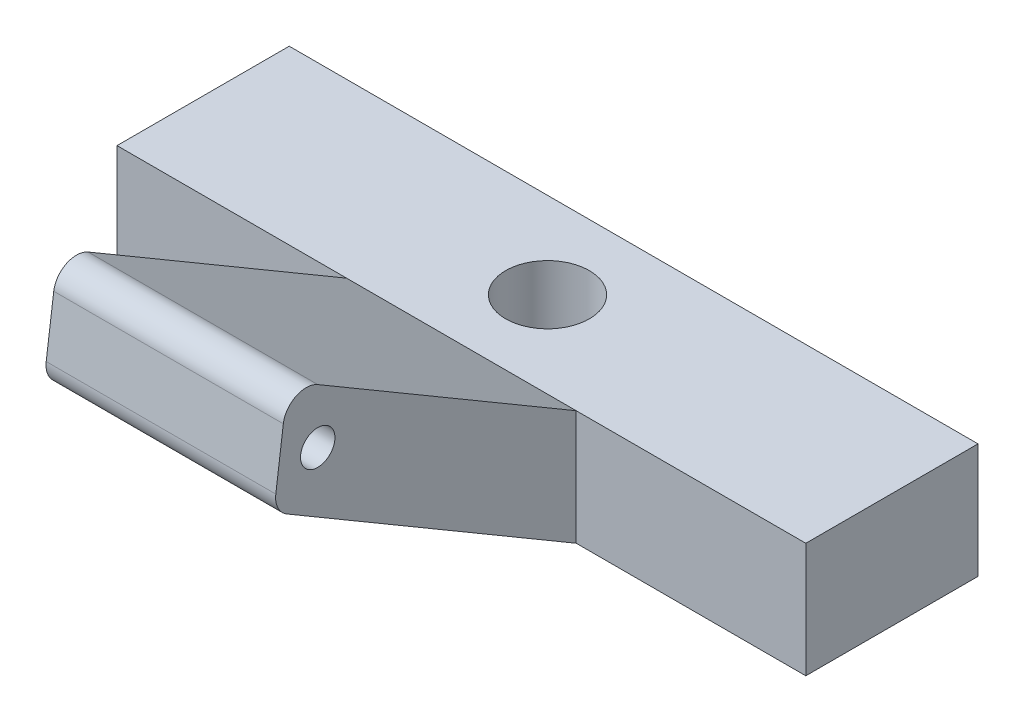
ISO-10303-21;
HEADER;
FILE_DESCRIPTION(('STEP AP214'),'2;1');
FILE_NAME('part.step','',(''),(''),'','','');
FILE_SCHEMA(('AUTOMOTIVE_DESIGN { 1 0 10303 214 1 1 1 1 }'));
ENDSEC;
DATA;
#1=APPLICATION_CONTEXT('core data for automotive mechanical design processes');
#2=APPLICATION_PROTOCOL_DEFINITION('international standard','automotive_design',2000,#1);
#3=PRODUCT_CONTEXT('',#1,'mechanical');
#4=PRODUCT('Part','Part','',(#3));
#5=PRODUCT_RELATED_PRODUCT_CATEGORY('part','',(#4));
#6=PRODUCT_DEFINITION_FORMATION('','',#4);
#7=PRODUCT_DEFINITION_CONTEXT('part definition',#1,'design');
#8=PRODUCT_DEFINITION('design','',#6,#7);
#9=PRODUCT_DEFINITION_SHAPE('','',#8);
#10=(LENGTH_UNIT() NAMED_UNIT(*) SI_UNIT(.MILLI.,.METRE.));
#11=(NAMED_UNIT(*) PLANE_ANGLE_UNIT() SI_UNIT($,.RADIAN.));
#12=(NAMED_UNIT(*) SI_UNIT($,.STERADIAN.) SOLID_ANGLE_UNIT());
#13=UNCERTAINTY_MEASURE_WITH_UNIT(LENGTH_MEASURE(1.E-05),#10,'distance_accuracy_value','');
#14=(GEOMETRIC_REPRESENTATION_CONTEXT(3) GLOBAL_UNCERTAINTY_ASSIGNED_CONTEXT((#13)) GLOBAL_UNIT_ASSIGNED_CONTEXT((#10,
#11,#12)) REPRESENTATION_CONTEXT('',''));
#15=CARTESIAN_POINT('',(0.,0.,0.));
#16=DIRECTION('',(0.,0.,1.));
#17=DIRECTION('',(1.,0.,0.));
#18=AXIS2_PLACEMENT_3D('',#15,#16,#17);
#19=CARTESIAN_POINT('',(-30.,10.,7.5));
#20=DIRECTION('',(0.,0.,-1.));
#21=DIRECTION('',(-1.,0.,0.));
#22=AXIS2_PLACEMENT_3D('',#19,#20,#21);
#23=PLANE('',#22);
#24=DIRECTION('',(0.,1.,0.));
#25=VECTOR('',#24,1.);
#26=CARTESIAN_POINT('',(10.,0.,7.5));
#27=LINE('',#26,#25);
#28=CARTESIAN_POINT('',(10.,0.,7.5));
#29=VERTEX_POINT('',#28);
#30=CARTESIAN_POINT('',(10.,10.,7.5));
#31=VERTEX_POINT('',#30);
#32=EDGE_CURVE('E143',#29,#31,#27,.T.);
#33=ORIENTED_EDGE('',*,*,#32,.F.);
#34=DIRECTION('',(1.,0.,0.));
#35=VECTOR('',#34,1.);
#36=CARTESIAN_POINT('',(-30.,0.,7.5));
#37=LINE('',#36,#35);
#38=CARTESIAN_POINT('',(30.,0.,7.5));
#39=VERTEX_POINT('',#38);
#40=EDGE_CURVE('E91',#29,#39,#37,.T.);
#41=ORIENTED_EDGE('',*,*,#40,.T.);
#42=DIRECTION('',(0.,-1.,0.));
#43=VECTOR('',#42,1.);
#44=CARTESIAN_POINT('',(30.,10.,7.5));
#45=LINE('',#44,#43);
#46=CARTESIAN_POINT('',(30.,10.,7.5));
#47=VERTEX_POINT('',#46);
#48=EDGE_CURVE('E154',#47,#39,#45,.T.);
#49=ORIENTED_EDGE('',*,*,#48,.F.);
#50=DIRECTION('',(1.,0.,0.));
#51=VECTOR('',#50,1.);
#52=CARTESIAN_POINT('',(-30.,10.,7.5));
#53=LINE('',#52,#51);
#54=EDGE_CURVE('E69',#31,#47,#53,.T.);
#55=ORIENTED_EDGE('',*,*,#54,.F.);
#56=EDGE_LOOP('',(#33,#41,#49,#55));
#57=FACE_BOUND('',#56,.T.);
#58=ADVANCED_FACE('F44',(#57),#23,.F.);
#59=CARTESIAN_POINT('',(0.,10.,0.));
#60=DIRECTION('',(0.,-1.,0.));
#61=DIRECTION('',(0.,0.,-1.));
#62=AXIS2_PLACEMENT_3D('',#59,#60,#61);
#63=PLANE('',#62);
#64=DIRECTION('',(0.,0.,-1.));
#65=VECTOR('',#64,1.);
#66=CARTESIAN_POINT('',(30.,10.,7.5));
#67=LINE('',#66,#65);
#68=CARTESIAN_POINT('',(30.,10.,-7.5));
#69=VERTEX_POINT('',#68);
#70=EDGE_CURVE('E186',#47,#69,#67,.T.);
#71=ORIENTED_EDGE('',*,*,#70,.T.);
#72=DIRECTION('',(-1.,0.,0.));
#73=VECTOR('',#72,1.);
#74=CARTESIAN_POINT('',(-30.,10.,-7.5));
#75=LINE('',#74,#73);
#76=CARTESIAN_POINT('',(-30.,10.,-7.5));
#77=VERTEX_POINT('',#76);
#78=EDGE_CURVE('E98',#69,#77,#75,.T.);
#79=ORIENTED_EDGE('',*,*,#78,.T.);
#80=DIRECTION('',(0.,0.,1.));
#81=VECTOR('',#80,1.);
#82=CARTESIAN_POINT('',(-30.,10.,7.5));
#83=LINE('',#82,#81);
#84=CARTESIAN_POINT('',(-30.,10.,7.5));
#85=VERTEX_POINT('',#84);
#86=EDGE_CURVE('E158',#77,#85,#83,.T.);
#87=ORIENTED_EDGE('',*,*,#86,.T.);
#88=CARTESIAN_POINT('',(-10.,10.,7.5));
#89=VERTEX_POINT('',#88);
#90=EDGE_CURVE('E157',#85,#89,#53,.T.);
#91=ORIENTED_EDGE('',*,*,#90,.T.);
#92=DIRECTION('',(1.,0.,0.));
#93=VECTOR('',#92,1.);
#94=CARTESIAN_POINT('',(-10.,10.,7.5));
#95=LINE('',#94,#93);
#96=EDGE_CURVE('E135',#89,#31,#95,.T.);
#97=ORIENTED_EDGE('',*,*,#96,.T.);
#98=ORIENTED_EDGE('',*,*,#54,.T.);
#99=EDGE_LOOP('',(#71,#79,#87,#91,#97,#98));
#100=FACE_BOUND('',#99,.T.);
#101=CARTESIAN_POINT('',(0.,10.,0.));
#102=DIRECTION('',(0.,1.,0.));
#103=DIRECTION('',(0.,0.,1.));
#104=AXIS2_PLACEMENT_3D('',#101,#102,#103);
#105=CIRCLE('',#104,3.64432939);
#106=CARTESIAN_POINT('',(0.,10.,3.64432939));
#107=VERTEX_POINT('',#106);
#108=EDGE_CURVE('E176',#107,#107,#105,.T.);
#109=ORIENTED_EDGE('',*,*,#108,.F.);
#110=EDGE_LOOP('',(#109));
#111=FACE_BOUND('',#110,.T.);
#112=ADVANCED_FACE('F161',(#100,#111),#63,.F.);
#113=CARTESIAN_POINT('',(0.,0.,0.));
#114=DIRECTION('',(0.,-1.,0.));
#115=DIRECTION('',(0.,0.,-1.));
#116=AXIS2_PLACEMENT_3D('',#113,#114,#115);
#117=PLANE('',#116);
#118=DIRECTION('',(0.,0.,-1.));
#119=VECTOR('',#118,1.);
#120=CARTESIAN_POINT('',(30.,0.,7.5));
#121=LINE('',#120,#119);
#122=CARTESIAN_POINT('',(30.,0.,-7.5));
#123=VERTEX_POINT('',#122);
#124=EDGE_CURVE('E180',#39,#123,#121,.T.);
#125=ORIENTED_EDGE('',*,*,#124,.F.);
#126=ORIENTED_EDGE('',*,*,#40,.F.);
#127=DIRECTION('',(1.,0.,0.));
#128=VECTOR('',#127,1.);
#129=CARTESIAN_POINT('',(-10.,0.,7.5));
#130=LINE('',#129,#128);
#131=CARTESIAN_POINT('',(-10.,0.,7.5));
#132=VERTEX_POINT('',#131);
#133=EDGE_CURVE('E185',#132,#29,#130,.T.);
#134=ORIENTED_EDGE('',*,*,#133,.F.);
#135=CARTESIAN_POINT('',(-30.,0.,7.5));
#136=VERTEX_POINT('',#135);
#137=EDGE_CURVE('E189',#136,#132,#37,.T.);
#138=ORIENTED_EDGE('',*,*,#137,.F.);
#139=DIRECTION('',(0.,0.,1.));
#140=VECTOR('',#139,1.);
#141=CARTESIAN_POINT('',(-30.,0.,7.5));
#142=LINE('',#141,#140);
#143=CARTESIAN_POINT('',(-30.,0.,-7.5));
#144=VERTEX_POINT('',#143);
#145=EDGE_CURVE('E201',#144,#136,#142,.T.);
#146=ORIENTED_EDGE('',*,*,#145,.F.);
#147=DIRECTION('',(-1.,0.,0.));
#148=VECTOR('',#147,1.);
#149=CARTESIAN_POINT('',(-30.,0.,-7.5));
#150=LINE('',#149,#148);
#151=EDGE_CURVE('E198',#123,#144,#150,.T.);
#152=ORIENTED_EDGE('',*,*,#151,.F.);
#153=EDGE_LOOP('',(#125,#126,#134,#138,#146,#152));
#154=FACE_BOUND('',#153,.T.);
#155=CARTESIAN_POINT('',(0.,0.,0.));
#156=DIRECTION('',(0.,1.,0.));
#157=DIRECTION('',(0.,0.,1.));
#158=AXIS2_PLACEMENT_3D('',#155,#156,#157);
#159=CIRCLE('',#158,3.64432939);
#160=CARTESIAN_POINT('',(0.,0.,3.64432939));
#161=VERTEX_POINT('',#160);
#162=EDGE_CURVE('E181',#161,#161,#159,.T.);
#163=ORIENTED_EDGE('',*,*,#162,.T.);
#164=EDGE_LOOP('',(#163));
#165=FACE_BOUND('',#164,.T.);
#166=ADVANCED_FACE('F222',(#154,#165),#117,.T.);
#167=CARTESIAN_POINT('',(30.,10.,7.5));
#168=DIRECTION('',(-1.,0.,0.));
#169=DIRECTION('',(0.,0.,1.));
#170=AXIS2_PLACEMENT_3D('',#167,#168,#169);
#171=PLANE('',#170);
#172=ORIENTED_EDGE('',*,*,#124,.T.);
#173=DIRECTION('',(0.,-1.,0.));
#174=VECTOR('',#173,1.);
#175=CARTESIAN_POINT('',(30.,10.,-7.5));
#176=LINE('',#175,#174);
#177=EDGE_CURVE('E11',#69,#123,#176,.T.);
#178=ORIENTED_EDGE('',*,*,#177,.F.);
#179=ORIENTED_EDGE('',*,*,#70,.F.);
#180=ORIENTED_EDGE('',*,*,#48,.T.);
#181=EDGE_LOOP('',(#172,#178,#179,#180));
#182=FACE_BOUND('',#181,.T.);
#183=ADVANCED_FACE('F46',(#182),#171,.F.);
#184=CARTESIAN_POINT('',(-30.,10.,-7.5));
#185=DIRECTION('',(0.,0.,1.));
#186=DIRECTION('',(1.,0.,0.));
#187=AXIS2_PLACEMENT_3D('',#184,#185,#186);
#188=PLANE('',#187);
#189=ORIENTED_EDGE('',*,*,#151,.T.);
#190=DIRECTION('',(0.,-1.,0.));
#191=VECTOR('',#190,1.);
#192=CARTESIAN_POINT('',(-30.,10.,-7.5));
#193=LINE('',#192,#191);
#194=EDGE_CURVE('E53',#77,#144,#193,.T.);
#195=ORIENTED_EDGE('',*,*,#194,.F.);
#196=ORIENTED_EDGE('',*,*,#78,.F.);
#197=ORIENTED_EDGE('',*,*,#177,.T.);
#198=EDGE_LOOP('',(#189,#195,#196,#197));
#199=FACE_BOUND('',#198,.T.);
#200=ADVANCED_FACE('F308',(#199),#188,.F.);
#201=CARTESIAN_POINT('',(-30.,10.,7.5));
#202=DIRECTION('',(1.,0.,0.));
#203=DIRECTION('',(0.,0.,-1.));
#204=AXIS2_PLACEMENT_3D('',#201,#202,#203);
#205=PLANE('',#204);
#206=ORIENTED_EDGE('',*,*,#145,.T.);
#207=DIRECTION('',(0.,-1.,0.));
#208=VECTOR('',#207,1.);
#209=CARTESIAN_POINT('',(-30.,10.,7.5));
#210=LINE('',#209,#208);
#211=EDGE_CURVE('E209',#85,#136,#210,.T.);
#212=ORIENTED_EDGE('',*,*,#211,.F.);
#213=ORIENTED_EDGE('',*,*,#86,.F.);
#214=ORIENTED_EDGE('',*,*,#194,.T.);
#215=EDGE_LOOP('',(#206,#212,#213,#214));
#216=FACE_BOUND('',#215,.T.);
#217=ADVANCED_FACE('F217',(#216),#205,.F.);
#218=ORIENTED_EDGE('',*,*,#137,.T.);
#219=DIRECTION('',(0.,1.,0.));
#220=VECTOR('',#219,1.);
#221=CARTESIAN_POINT('',(-10.,0.,7.5));
#222=LINE('',#221,#220);
#223=EDGE_CURVE('E227',#132,#89,#222,.T.);
#224=ORIENTED_EDGE('',*,*,#223,.T.);
#225=ORIENTED_EDGE('',*,*,#90,.F.);
#226=ORIENTED_EDGE('',*,*,#211,.T.);
#227=EDGE_LOOP('',(#218,#224,#225,#226));
#228=FACE_BOUND('',#227,.T.);
#229=ADVANCED_FACE('F226',(#228),#23,.F.);
#230=CARTESIAN_POINT('',(0.,10.,0.));
#231=DIRECTION('',(0.,-1.,0.));
#232=DIRECTION('',(0.,0.,-1.));
#233=AXIS2_PLACEMENT_3D('',#230,#231,#232);
#234=CYLINDRICAL_SURFACE('',#233,3.64432939);
#235=ORIENTED_EDGE('',*,*,#108,.T.);
#236=EDGE_LOOP('',(#235));
#237=FACE_BOUND('',#236,.T.);
#238=ORIENTED_EDGE('',*,*,#162,.F.);
#239=EDGE_LOOP('',(#238));
#240=FACE_BOUND('',#239,.T.);
#241=ADVANCED_FACE('F299',(#237,#240),#234,.F.);
#242=CARTESIAN_POINT('',(-10.,0.,7.5));
#243=DIRECTION('',(0.,-0.862171609476739,0.506616339859157));
#244=DIRECTION('',(0.,-0.506616339859157,-0.862171609476739));
#245=AXIS2_PLACEMENT_3D('',#242,#243,#244);
#246=PLANE('',#245);
#247=ORIENTED_EDGE('',*,*,#133,.T.);
#248=DIRECTION('',(0.,-0.506616339859157,-0.862171609476739));
#249=VECTOR('',#248,1.);
#250=CARTESIAN_POINT('',(10.,0.,7.5));
#251=LINE('',#250,#249);
#252=CARTESIAN_POINT('',(10.,14.8076057402578,32.6999319191409));
#253=VERTEX_POINT('',#252);
#254=EDGE_CURVE('E150',#253,#29,#251,.T.);
#255=ORIENTED_EDGE('',*,*,#254,.F.);
#256=DIRECTION('',(1.,0.,0.));
#257=VECTOR('',#256,1.);
#258=CARTESIAN_POINT('',(-10.,14.8076057402578,32.6999319191409));
#259=LINE('',#258,#257);
#260=CARTESIAN_POINT('',(-10.,14.8076057402578,32.6999319191409));
#261=VERTEX_POINT('',#260);
#262=EDGE_CURVE('E252',#261,#253,#259,.T.);
#263=ORIENTED_EDGE('',*,*,#262,.F.);
#264=DIRECTION('',(0.,-0.506616339859157,-0.862171609476739));
#265=VECTOR('',#264,1.);
#266=CARTESIAN_POINT('',(-10.,0.,7.5));
#267=LINE('',#266,#265);
#268=EDGE_CURVE('E165',#261,#132,#267,.T.);
#269=ORIENTED_EDGE('',*,*,#268,.T.);
#270=EDGE_LOOP('',(#247,#255,#263,#269));
#271=FACE_BOUND('',#270,.T.);
#272=ADVANCED_FACE('F304',(#271),#246,.T.);
#273=CARTESIAN_POINT('',(-10.,16.5319489592113,31.6866992394226));
#274=DIRECTION('',(1.,0.,0.));
#275=DIRECTION('',(0.,0.,-1.));
#276=AXIS2_PLACEMENT_3D('',#273,#274,#275);
#277=CYLINDRICAL_SURFACE('',#276,2.);
#278=ORIENTED_EDGE('',*,*,#262,.T.);
#279=CARTESIAN_POINT('',(10.,16.5319489592113,31.6866992394226));
#280=DIRECTION('',(1.,0.,0.));
#281=DIRECTION('',(0.,0.,-1.));
#282=AXIS2_PLACEMENT_3D('',#279,#280,#281);
#283=CIRCLE('',#282,2.);
#284=CARTESIAN_POINT('',(10.,16.7938462890689,33.6694775398418));
#285=VERTEX_POINT('',#284);
#286=EDGE_CURVE('E270',#285,#253,#283,.T.);
#287=ORIENTED_EDGE('',*,*,#286,.F.);
#288=DIRECTION('',(1.,0.,0.));
#289=VECTOR('',#288,1.);
#290=CARTESIAN_POINT('',(-10.,16.7938462890689,33.6694775398418));
#291=LINE('',#290,#289);
#292=CARTESIAN_POINT('',(-10.,16.7938462890689,33.6694775398418));
#293=VERTEX_POINT('',#292);
#294=EDGE_CURVE('E255',#293,#285,#291,.T.);
#295=ORIENTED_EDGE('',*,*,#294,.F.);
#296=CARTESIAN_POINT('',(-10.,16.5319489592113,31.6866992394226));
#297=DIRECTION('',(1.,0.,0.));
#298=DIRECTION('',(0.,0.,-1.));
#299=AXIS2_PLACEMENT_3D('',#296,#297,#298);
#300=CIRCLE('',#299,2.);
#301=EDGE_CURVE('E172',#293,#261,#300,.T.);
#302=ORIENTED_EDGE('',*,*,#301,.T.);
#303=EDGE_LOOP('',(#278,#287,#295,#302));
#304=FACE_BOUND('',#303,.T.);
#305=ADVANCED_FACE('F329',(#304),#277,.T.);
#306=CARTESIAN_POINT('',(-10.,16.7938462890689,33.6694775398418));
#307=DIRECTION('',(0.,0.1309486649288,0.991389150209626));
#308=DIRECTION('',(0.,-0.991389150209626,0.1309486649288));
#309=AXIS2_PLACEMENT_3D('',#306,#307,#308);
#310=PLANE('',#309);
#311=ORIENTED_EDGE('',*,*,#294,.T.);
#312=DIRECTION('',(0.,-0.991389150209626,0.1309486649288));
#313=VECTOR('',#312,1.);
#314=CARTESIAN_POINT('',(10.,16.7938462890689,33.6694775398418));
#315=LINE('',#314,#313);
#316=CARTESIAN_POINT('',(10.,21.7683087038827,33.0124205084827));
#317=VERTEX_POINT('',#316);
#318=EDGE_CURVE('E264',#317,#285,#315,.T.);
#319=ORIENTED_EDGE('',*,*,#318,.F.);
#320=DIRECTION('',(1.,0.,0.));
#321=VECTOR('',#320,1.);
#322=CARTESIAN_POINT('',(-10.,21.7683087038827,33.0124205084827));
#323=LINE('',#322,#321);
#324=CARTESIAN_POINT('',(-10.,21.7683087038827,33.0124205084827));
#325=VERTEX_POINT('',#324);
#326=EDGE_CURVE('E169',#325,#317,#323,.T.);
#327=ORIENTED_EDGE('',*,*,#326,.F.);
#328=DIRECTION('',(0.,-0.991389150209626,0.1309486649288));
#329=VECTOR('',#328,1.);
#330=CARTESIAN_POINT('',(-10.,16.7938462890689,33.6694775398418));
#331=LINE('',#330,#329);
#332=EDGE_CURVE('E243',#325,#293,#331,.T.);
#333=ORIENTED_EDGE('',*,*,#332,.T.);
#334=EDGE_LOOP('',(#311,#319,#327,#333));
#335=FACE_BOUND('',#334,.T.);
#336=ADVANCED_FACE('F268',(#335),#310,.T.);
#337=CARTESIAN_POINT('',(-10.,21.5064113740251,31.0296422080635));
#338=DIRECTION('',(1.,0.,0.));
#339=DIRECTION('',(0.,0.,-1.));
#340=AXIS2_PLACEMENT_3D('',#337,#338,#339);
#341=CYLINDRICAL_SURFACE('',#340,2.);
#342=ORIENTED_EDGE('',*,*,#326,.T.);
#343=CARTESIAN_POINT('',(10.,21.5064113740251,31.0296422080635));
#344=DIRECTION('',(1.,0.,0.));
#345=DIRECTION('',(0.,0.,-1.));
#346=AXIS2_PLACEMENT_3D('',#343,#344,#345);
#347=CIRCLE('',#346,2.);
#348=CARTESIAN_POINT('',(10.,23.2307545929785,30.0164095283452));
#349=VERTEX_POINT('',#348);
#350=EDGE_CURVE('E142',#349,#317,#347,.T.);
#351=ORIENTED_EDGE('',*,*,#350,.F.);
#352=DIRECTION('',(1.,0.,0.));
#353=VECTOR('',#352,1.);
#354=CARTESIAN_POINT('',(-10.,23.2307545929785,30.0164095283452));
#355=LINE('',#354,#353);
#356=CARTESIAN_POINT('',(-10.,23.2307545929785,30.0164095283452));
#357=VERTEX_POINT('',#356);
#358=EDGE_CURVE('E137',#357,#349,#355,.T.);
#359=ORIENTED_EDGE('',*,*,#358,.F.);
#360=CARTESIAN_POINT('',(-10.,21.5064113740251,31.0296422080635));
#361=DIRECTION('',(1.,0.,0.));
#362=DIRECTION('',(0.,0.,-1.));
#363=AXIS2_PLACEMENT_3D('',#360,#361,#362);
#364=CIRCLE('',#363,2.);
#365=EDGE_CURVE('E234',#357,#325,#364,.T.);
#366=ORIENTED_EDGE('',*,*,#365,.T.);
#367=EDGE_LOOP('',(#342,#351,#359,#366));
#368=FACE_BOUND('',#367,.T.);
#369=ADVANCED_FACE('F259',(#368),#341,.T.);
#370=CARTESIAN_POINT('',(-10.,10.,7.5));
#371=DIRECTION('',(0.,0.862171609476739,-0.506616339859157));
#372=DIRECTION('',(0.,0.506616339859157,0.862171609476739));
#373=AXIS2_PLACEMENT_3D('',#370,#371,#372);
#374=PLANE('',#373);
#375=ORIENTED_EDGE('',*,*,#358,.T.);
#376=DIRECTION('',(0.,0.506616339859157,0.862171609476739));
#377=VECTOR('',#376,1.);
#378=CARTESIAN_POINT('',(10.,10.,7.5));
#379=LINE('',#378,#377);
#380=EDGE_CURVE('E132',#31,#349,#379,.T.);
#381=ORIENTED_EDGE('',*,*,#380,.F.);
#382=ORIENTED_EDGE('',*,*,#96,.F.);
#383=DIRECTION('',(0.,0.506616339859157,0.862171609476739));
#384=VECTOR('',#383,1.);
#385=CARTESIAN_POINT('',(-10.,10.,7.5));
#386=LINE('',#385,#384);
#387=EDGE_CURVE('E60',#89,#357,#386,.T.);
#388=ORIENTED_EDGE('',*,*,#387,.T.);
#389=EDGE_LOOP('',(#375,#381,#382,#388));
#390=FACE_BOUND('',#389,.T.);
#391=ADVANCED_FACE('F134',(#390),#374,.T.);
#392=CARTESIAN_POINT('',(-10.,21.5064113740251,31.0296422080635));
#393=DIRECTION('',(1.,0.,0.));
#394=DIRECTION('',(0.,0.,-1.));
#395=AXIS2_PLACEMENT_3D('',#392,#393,#394);
#396=PLANE('',#395);
#397=CARTESIAN_POINT('',(-10.,18.4840143958913,30.0164095283452));
#398=DIRECTION('',(1.,0.,0.));
#399=DIRECTION('',(0.,0.,-1.));
#400=AXIS2_PLACEMENT_3D('',#397,#398,#399);
#401=CIRCLE('',#400,1.5);
#402=CARTESIAN_POINT('',(-10.,18.4840143958913,28.5164095283452));
#403=VERTEX_POINT('',#402);
#404=EDGE_CURVE('E230',#403,#403,#401,.T.);
#405=ORIENTED_EDGE('',*,*,#404,.T.);
#406=EDGE_LOOP('',(#405));
#407=FACE_BOUND('',#406,.T.);
#408=ORIENTED_EDGE('',*,*,#223,.F.);
#409=ORIENTED_EDGE('',*,*,#268,.F.);
#410=ORIENTED_EDGE('',*,*,#301,.F.);
#411=ORIENTED_EDGE('',*,*,#332,.F.);
#412=ORIENTED_EDGE('',*,*,#365,.F.);
#413=ORIENTED_EDGE('',*,*,#387,.F.);
#414=EDGE_LOOP('',(#408,#409,#410,#411,#412,#413));
#415=FACE_BOUND('',#414,.T.);
#416=ADVANCED_FACE('F286',(#407,#415),#396,.F.);
#417=CARTESIAN_POINT('',(-10.,18.4840143958913,30.0164095283452));
#418=DIRECTION('',(1.,0.,0.));
#419=DIRECTION('',(0.,0.,-1.));
#420=AXIS2_PLACEMENT_3D('',#417,#418,#419);
#421=CYLINDRICAL_SURFACE('',#420,1.5);
#422=ORIENTED_EDGE('',*,*,#404,.F.);
#423=EDGE_LOOP('',(#422));
#424=FACE_BOUND('',#423,.T.);
#425=CARTESIAN_POINT('',(10.,18.4840143958913,30.0164095283452));
#426=DIRECTION('',(1.,0.,0.));
#427=DIRECTION('',(0.,0.,-1.));
#428=AXIS2_PLACEMENT_3D('',#425,#426,#427);
#429=CIRCLE('',#428,1.5);
#430=CARTESIAN_POINT('',(10.,18.4840143958913,28.5164095283452));
#431=VERTEX_POINT('',#430);
#432=EDGE_CURVE('E152',#431,#431,#429,.T.);
#433=ORIENTED_EDGE('',*,*,#432,.T.);
#434=EDGE_LOOP('',(#433));
#435=FACE_BOUND('',#434,.T.);
#436=ADVANCED_FACE('F280',(#424,#435),#421,.F.);
#437=CARTESIAN_POINT('',(10.,21.5064113740251,31.0296422080635));
#438=DIRECTION('',(1.,0.,0.));
#439=DIRECTION('',(0.,0.,-1.));
#440=AXIS2_PLACEMENT_3D('',#437,#438,#439);
#441=PLANE('',#440);
#442=ORIENTED_EDGE('',*,*,#32,.T.);
#443=ORIENTED_EDGE('',*,*,#380,.T.);
#444=ORIENTED_EDGE('',*,*,#350,.T.);
#445=ORIENTED_EDGE('',*,*,#318,.T.);
#446=ORIENTED_EDGE('',*,*,#286,.T.);
#447=ORIENTED_EDGE('',*,*,#254,.T.);
#448=EDGE_LOOP('',(#442,#443,#444,#445,#446,#447));
#449=FACE_BOUND('',#448,.T.);
#450=ORIENTED_EDGE('',*,*,#432,.F.);
#451=EDGE_LOOP('',(#450));
#452=FACE_BOUND('',#451,.T.);
#453=ADVANCED_FACE('F146',(#449,#452),#441,.T.);
#454=CLOSED_SHELL('',(#58,#112,#166,#183,#200,#217,#229,#241,#272,#305,#336,#369,#391,#416,#436,#453));
#455=MANIFOLD_SOLID_BREP('B2',#454);
#456=ADVANCED_BREP_SHAPE_REPRESENTATION('',(#18,#455),#14);
#457=SHAPE_DEFINITION_REPRESENTATION(#9,#456);
ENDSEC;
END-ISO-10303-21;
